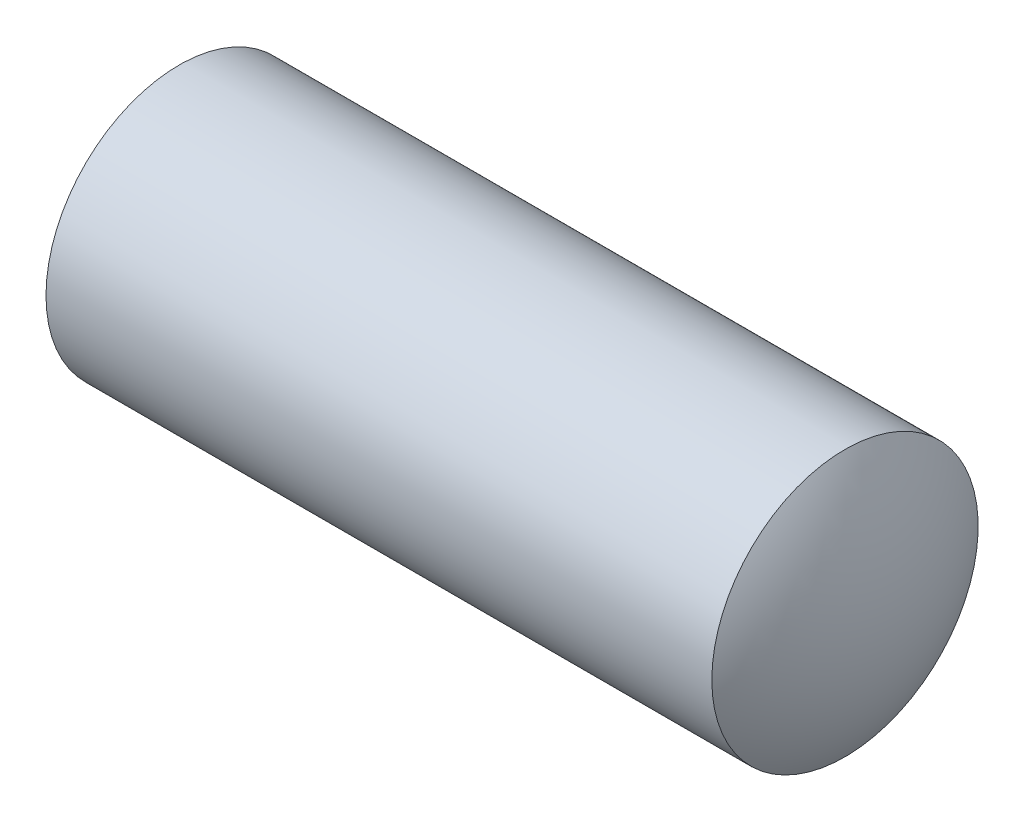
ISO-10303-21;
HEADER;
FILE_DESCRIPTION(('STEP AP214'),'2;1');
FILE_NAME('part.step','',(''),(''),'','','');
FILE_SCHEMA(('AUTOMOTIVE_DESIGN { 1 0 10303 214 1 1 1 1 }'));
ENDSEC;
DATA;
#1=APPLICATION_CONTEXT('core data for automotive mechanical design processes');
#2=APPLICATION_PROTOCOL_DEFINITION('international standard','automotive_design',2000,#1);
#3=PRODUCT_CONTEXT('',#1,'mechanical');
#4=PRODUCT('Part','Part','',(#3));
#5=PRODUCT_RELATED_PRODUCT_CATEGORY('part','',(#4));
#6=PRODUCT_DEFINITION_FORMATION('','',#4);
#7=PRODUCT_DEFINITION_CONTEXT('part definition',#1,'design');
#8=PRODUCT_DEFINITION('design','',#6,#7);
#9=PRODUCT_DEFINITION_SHAPE('','',#8);
#10=(LENGTH_UNIT() NAMED_UNIT(*) SI_UNIT(.MILLI.,.METRE.));
#11=(NAMED_UNIT(*) PLANE_ANGLE_UNIT() SI_UNIT($,.RADIAN.));
#12=(NAMED_UNIT(*) SI_UNIT($,.STERADIAN.) SOLID_ANGLE_UNIT());
#13=UNCERTAINTY_MEASURE_WITH_UNIT(LENGTH_MEASURE(1.E-05),#10,'distance_accuracy_value','');
#14=(GEOMETRIC_REPRESENTATION_CONTEXT(3) GLOBAL_UNCERTAINTY_ASSIGNED_CONTEXT((#13)) GLOBAL_UNIT_ASSIGNED_CONTEXT((#10,
#11,#12)) REPRESENTATION_CONTEXT('',''));
#15=CARTESIAN_POINT('',(0.,0.,0.));
#16=DIRECTION('',(0.,0.,1.));
#17=DIRECTION('',(1.,0.,0.));
#18=AXIS2_PLACEMENT_3D('',#15,#16,#17);
#19=CARTESIAN_POINT('',(-1.96666666666667,0.,0.));
#20=DIRECTION('',(0.,1.,0.));
#21=DIRECTION('',(1.,0.,0.));
#22=AXIS2_PLACEMENT_3D('',#19,#20,#21);
#23=SPHERICAL_SURFACE('',#22,3.63333333333333);
#24=CARTESIAN_POINT('',(-5.,0.,0.));
#25=DIRECTION('',(-1.,0.,0.));
#26=DIRECTION('',(0.,0.,1.));
#27=AXIS2_PLACEMENT_3D('',#24,#25,#26);
#28=CIRCLE('',#27,2.);
#29=CARTESIAN_POINT('',(-5.,0.,2.));
#30=VERTEX_POINT('',#29);
#31=EDGE_CURVE('E10',#30,#30,#28,.F.);
#32=ORIENTED_EDGE('',*,*,#31,.F.);
#33=EDGE_LOOP('',(#32));
#34=FACE_BOUND('',#33,.T.);
#35=ADVANCED_FACE('F16',(#34),#23,.T.);
#36=CARTESIAN_POINT('',(1.96666666666667,0.,0.));
#37=DIRECTION('',(0.,1.,0.));
#38=DIRECTION('',(1.,0.,0.));
#39=AXIS2_PLACEMENT_3D('',#36,#37,#38);
#40=SPHERICAL_SURFACE('',#39,3.63333333333333);
#41=CARTESIAN_POINT('',(5.,0.,0.));
#42=DIRECTION('',(-1.,0.,0.));
#43=DIRECTION('',(0.,0.,1.));
#44=AXIS2_PLACEMENT_3D('',#41,#42,#43);
#45=CIRCLE('',#44,2.);
#46=CARTESIAN_POINT('',(5.,0.,2.));
#47=VERTEX_POINT('',#46);
#48=EDGE_CURVE('E20',#47,#47,#45,.T.);
#49=ORIENTED_EDGE('',*,*,#48,.F.);
#50=EDGE_LOOP('',(#49));
#51=FACE_BOUND('',#50,.T.);
#52=ADVANCED_FACE('F30',(#51),#40,.T.);
#53=CARTESIAN_POINT('',(-4.78185842773571,0.,0.));
#54=DIRECTION('',(-1.,0.,0.));
#55=DIRECTION('',(0.,0.,1.));
#56=AXIS2_PLACEMENT_3D('',#53,#54,#55);
#57=CYLINDRICAL_SURFACE('',#56,2.);
#58=ORIENTED_EDGE('',*,*,#31,.T.);
#59=EDGE_LOOP('',(#58));
#60=FACE_BOUND('',#59,.T.);
#61=ORIENTED_EDGE('',*,*,#48,.T.);
#62=EDGE_LOOP('',(#61));
#63=FACE_BOUND('',#62,.T.);
#64=ADVANCED_FACE('F33',(#60,#63),#57,.T.);
#65=CLOSED_SHELL('',(#35,#52,#64));
#66=MANIFOLD_SOLID_BREP('B1',#65);
#67=ADVANCED_BREP_SHAPE_REPRESENTATION('',(#18,#66),#14);
#68=SHAPE_DEFINITION_REPRESENTATION(#9,#67);
ENDSEC;
END-ISO-10303-21;
